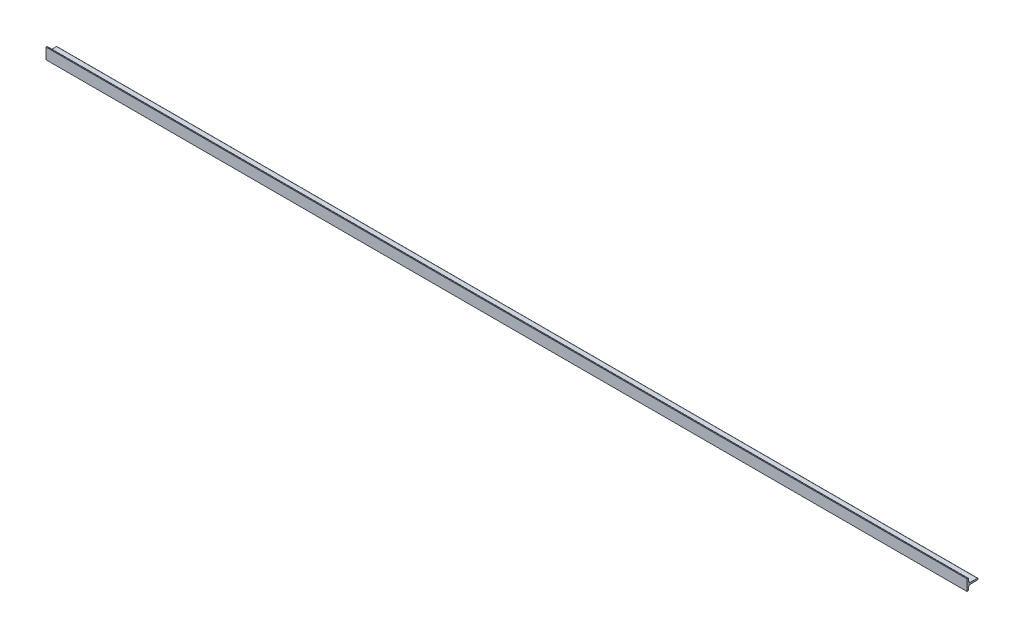
ISO-10303-21;
HEADER;
FILE_DESCRIPTION(('STEP AP214'),'2;1');
FILE_NAME('part.step','',(''),(''),'','','');
FILE_SCHEMA(('AUTOMOTIVE_DESIGN { 1 0 10303 214 1 1 1 1 }'));
ENDSEC;
DATA;
#1=APPLICATION_CONTEXT('core data for automotive mechanical design processes');
#2=APPLICATION_PROTOCOL_DEFINITION('international standard','automotive_design',2000,#1);
#3=PRODUCT_CONTEXT('',#1,'mechanical');
#4=PRODUCT('Part','Part','',(#3));
#5=PRODUCT_RELATED_PRODUCT_CATEGORY('part','',(#4));
#6=PRODUCT_DEFINITION_FORMATION('','',#4);
#7=PRODUCT_DEFINITION_CONTEXT('part definition',#1,'design');
#8=PRODUCT_DEFINITION('design','',#6,#7);
#9=PRODUCT_DEFINITION_SHAPE('','',#8);
#10=(LENGTH_UNIT() NAMED_UNIT(*) SI_UNIT(.MILLI.,.METRE.));
#11=(NAMED_UNIT(*) PLANE_ANGLE_UNIT() SI_UNIT($,.RADIAN.));
#12=(NAMED_UNIT(*) SI_UNIT($,.STERADIAN.) SOLID_ANGLE_UNIT());
#13=UNCERTAINTY_MEASURE_WITH_UNIT(LENGTH_MEASURE(1.E-05),#10,'distance_accuracy_value','');
#14=(GEOMETRIC_REPRESENTATION_CONTEXT(3) GLOBAL_UNCERTAINTY_ASSIGNED_CONTEXT((#13)) GLOBAL_UNIT_ASSIGNED_CONTEXT((#10,
#11,#12)) REPRESENTATION_CONTEXT('',''));
#15=CARTESIAN_POINT('',(0.,0.,0.));
#16=DIRECTION('',(0.,0.,1.));
#17=DIRECTION('',(1.,0.,0.));
#18=AXIS2_PLACEMENT_3D('',#15,#16,#17);
#19=CARTESIAN_POINT('',(1674.,-9.99999999999999,20.));
#20=DIRECTION('',(0.,1.,0.));
#21=DIRECTION('',(0.,0.,1.));
#22=AXIS2_PLACEMENT_3D('',#19,#20,#21);
#23=PLANE('',#22);
#24=DIRECTION('',(0.,0.,-1.));
#25=VECTOR('',#24,1.);
#26=CARTESIAN_POINT('',(0.,-9.99999999999999,20.));
#27=LINE('',#26,#25);
#28=CARTESIAN_POINT('',(0.,-9.99999999999999,20.));
#29=VERTEX_POINT('',#28);
#30=CARTESIAN_POINT('',(0.,-9.99999999999999,18.570314587422));
#31=VERTEX_POINT('',#30);
#32=EDGE_CURVE('E216',#29,#31,#27,.T.);
#33=ORIENTED_EDGE('',*,*,#32,.T.);
#34=DIRECTION('',(-1.,0.,0.));
#35=VECTOR('',#34,1.);
#36=CARTESIAN_POINT('',(1674.,-9.99999999999999,18.570314587422));
#37=LINE('',#36,#35);
#38=CARTESIAN_POINT('',(1674.,-9.99999999999999,18.570314587422));
#39=VERTEX_POINT('',#38);
#40=EDGE_CURVE('E13',#39,#31,#37,.T.);
#41=ORIENTED_EDGE('',*,*,#40,.F.);
#42=DIRECTION('',(0.,0.,-1.));
#43=VECTOR('',#42,1.);
#44=CARTESIAN_POINT('',(1674.,-9.99999999999999,20.));
#45=LINE('',#44,#43);
#46=CARTESIAN_POINT('',(1674.,-9.99999999999999,20.));
#47=VERTEX_POINT('',#46);
#48=EDGE_CURVE('E242',#47,#39,#45,.T.);
#49=ORIENTED_EDGE('',*,*,#48,.F.);
#50=DIRECTION('',(-1.,0.,0.));
#51=VECTOR('',#50,1.);
#52=CARTESIAN_POINT('',(1674.,-9.99999999999999,20.));
#53=LINE('',#52,#51);
#54=EDGE_CURVE('E212',#47,#29,#53,.T.);
#55=ORIENTED_EDGE('',*,*,#54,.T.);
#56=EDGE_LOOP('',(#33,#41,#49,#55));
#57=FACE_BOUND('',#56,.T.);
#58=ADVANCED_FACE('F84',(#57),#23,.F.);
#59=CARTESIAN_POINT('',(1674.,-8.49999999999999,18.570314587422));
#60=DIRECTION('',(-1.,0.,0.));
#61=DIRECTION('',(0.,0.,1.));
#62=AXIS2_PLACEMENT_3D('',#59,#60,#61);
#63=CYLINDRICAL_SURFACE('',#62,1.5);
#64=CARTESIAN_POINT('',(0.,-8.49999999999999,18.570314587422));
#65=DIRECTION('',(1.,0.,0.));
#66=DIRECTION('',(0.,0.,1.));
#67=AXIS2_PLACEMENT_3D('',#64,#65,#66);
#68=CIRCLE('',#67,1.5);
#69=CARTESIAN_POINT('',(0.,-8.53000020943977,17.0706146216177));
#70=VERTEX_POINT('',#69);
#71=EDGE_CURVE('E219',#31,#70,#68,.T.);
#72=ORIENTED_EDGE('',*,*,#71,.T.);
#73=DIRECTION('',(-1.,0.,0.));
#74=VECTOR('',#73,1.);
#75=CARTESIAN_POINT('',(1674.,-8.53000020943977,17.0706146216177));
#76=LINE('',#75,#74);
#77=CARTESIAN_POINT('',(1674.,-8.53000020943977,17.0706146216177));
#78=VERTEX_POINT('',#77);
#79=EDGE_CURVE('E92',#78,#70,#76,.T.);
#80=ORIENTED_EDGE('',*,*,#79,.F.);
#81=CARTESIAN_POINT('',(1674.,-8.49999999999999,18.570314587422));
#82=DIRECTION('',(1.,0.,0.));
#83=DIRECTION('',(0.,0.,1.));
#84=AXIS2_PLACEMENT_3D('',#81,#82,#83);
#85=CIRCLE('',#84,1.5);
#86=EDGE_CURVE('E161',#39,#78,#85,.T.);
#87=ORIENTED_EDGE('',*,*,#86,.F.);
#88=ORIENTED_EDGE('',*,*,#40,.T.);
#89=EDGE_LOOP('',(#72,#80,#87,#88));
#90=FACE_BOUND('',#89,.T.);
#91=ADVANCED_FACE('F330',(#90),#63,.T.);
#92=CARTESIAN_POINT('',(1674.,-4.52043643216432,16.9904067428265));
#93=DIRECTION('',(0.,0.020000139626522,0.9997999772029));
#94=DIRECTION('',(0.,-0.9997999772029,0.020000139626522));
#95=AXIS2_PLACEMENT_3D('',#92,#93,#94);
#96=PLANE('',#95);
#97=DIRECTION('',(0.,0.9997999772029,-0.020000139626522));
#98=VECTOR('',#97,1.);
#99=CARTESIAN_POINT('',(0.,-4.52043643216432,16.9904067428265));
#100=LINE('',#99,#98);
#101=CARTESIAN_POINT('',(0.,-4.52043643216432,16.9904067428265));
#102=VERTEX_POINT('',#101);
#103=EDGE_CURVE('E221',#70,#102,#100,.T.);
#104=ORIENTED_EDGE('',*,*,#103,.T.);
#105=DIRECTION('',(-1.,0.,0.));
#106=VECTOR('',#105,1.);
#107=CARTESIAN_POINT('',(1674.,-4.52043643216432,16.9904067428265));
#108=LINE('',#107,#106);
#109=CARTESIAN_POINT('',(1674.,-4.52043643216432,16.9904067428265));
#110=VERTEX_POINT('',#109);
#111=EDGE_CURVE('E267',#110,#102,#108,.T.);
#112=ORIENTED_EDGE('',*,*,#111,.F.);
#113=DIRECTION('',(0.,0.9997999772029,-0.020000139626522));
#114=VECTOR('',#113,1.);
#115=CARTESIAN_POINT('',(1674.,-4.52043643216432,16.9904067428265));
#116=LINE('',#115,#114);
#117=EDGE_CURVE('E275',#78,#110,#116,.T.);
#118=ORIENTED_EDGE('',*,*,#117,.F.);
#119=ORIENTED_EDGE('',*,*,#79,.T.);
#120=EDGE_LOOP('',(#104,#112,#118,#119));
#121=FACE_BOUND('',#120,.T.);
#122=ADVANCED_FACE('F273',(#121),#96,.F.);
#123=CARTESIAN_POINT('',(1674.,-4.58043685104389,13.9910068112178));
#124=DIRECTION('',(-1.,0.,0.));
#125=DIRECTION('',(0.,0.,1.));
#126=AXIS2_PLACEMENT_3D('',#123,#124,#125);
#127=CYLINDRICAL_SURFACE('',#126,3.);
#128=CARTESIAN_POINT('',(0.,-4.58043685104389,13.9910068112178));
#129=DIRECTION('',(-1.,0.,0.));
#130=DIRECTION('',(0.,0.,-1.));
#131=AXIS2_PLACEMENT_3D('',#128,#129,#130);
#132=CIRCLE('',#131,3.);
#133=CARTESIAN_POINT('',(0.,-1.58103691943519,14.0510072300973));
#134=VERTEX_POINT('',#133);
#135=EDGE_CURVE('E223',#102,#134,#132,.T.);
#136=ORIENTED_EDGE('',*,*,#135,.T.);
#137=DIRECTION('',(-1.,0.,0.));
#138=VECTOR('',#137,1.);
#139=CARTESIAN_POINT('',(1674.,-1.58103691943519,14.0510072300973));
#140=LINE('',#139,#138);
#141=CARTESIAN_POINT('',(1674.,-1.58103691943519,14.0510072300973));
#142=VERTEX_POINT('',#141);
#143=EDGE_CURVE('E264',#142,#134,#140,.T.);
#144=ORIENTED_EDGE('',*,*,#143,.F.);
#145=CARTESIAN_POINT('',(1674.,-4.58043685104389,13.9910068112178));
#146=DIRECTION('',(-1.,0.,0.));
#147=DIRECTION('',(0.,0.,-1.));
#148=AXIS2_PLACEMENT_3D('',#145,#146,#147);
#149=CIRCLE('',#148,3.);
#150=EDGE_CURVE('E293',#110,#142,#149,.T.);
#151=ORIENTED_EDGE('',*,*,#150,.F.);
#152=ORIENTED_EDGE('',*,*,#111,.T.);
#153=EDGE_LOOP('',(#136,#144,#151,#152));
#154=FACE_BOUND('',#153,.T.);
#155=ADVANCED_FACE('F284',(#154),#127,.F.);
#156=CARTESIAN_POINT('',(1674.,-1.3195626461658,0.97999986037347));
#157=DIRECTION('',(0.,0.9997999772029,0.0200001396265305));
#158=DIRECTION('',(0.,-0.0200001396265305,0.9997999772029));
#159=AXIS2_PLACEMENT_3D('',#156,#157,#158);
#160=PLANE('',#159);
#161=DIRECTION('',(0.,0.0200001396265305,-0.9997999772029));
#162=VECTOR('',#161,1.);
#163=CARTESIAN_POINT('',(0.,-1.3195626461658,0.97999986037347));
#164=LINE('',#163,#162);
#165=CARTESIAN_POINT('',(0.,-1.3195626461658,0.979999860373471));
#166=VERTEX_POINT('',#165);
#167=EDGE_CURVE('E225',#134,#166,#164,.T.);
#168=ORIENTED_EDGE('',*,*,#167,.T.);
#169=DIRECTION('',(-1.,0.,0.));
#170=VECTOR('',#169,1.);
#171=CARTESIAN_POINT('',(1674.,-1.3195626461658,0.979999860373471));
#172=LINE('',#171,#170);
#173=CARTESIAN_POINT('',(1674.,-1.3195626461658,0.979999860373471));
#174=VERTEX_POINT('',#173);
#175=EDGE_CURVE('E261',#174,#166,#172,.T.);
#176=ORIENTED_EDGE('',*,*,#175,.F.);
#177=DIRECTION('',(0.,0.0200001396265305,-0.9997999772029));
#178=VECTOR('',#177,1.);
#179=CARTESIAN_POINT('',(1674.,-1.3195626461658,0.97999986037347));
#180=LINE('',#179,#178);
#181=EDGE_CURVE('E290',#142,#174,#180,.T.);
#182=ORIENTED_EDGE('',*,*,#181,.F.);
#183=ORIENTED_EDGE('',*,*,#143,.T.);
#184=EDGE_LOOP('',(#168,#176,#182,#183));
#185=FACE_BOUND('',#184,.T.);
#186=ADVANCED_FACE('F288',(#185),#160,.F.);
#187=CARTESIAN_POINT('',(1674.,-0.319762668962899,1.));
#188=DIRECTION('',(-1.,0.,0.));
#189=DIRECTION('',(0.,0.,1.));
#190=AXIS2_PLACEMENT_3D('',#187,#188,#189);
#191=CYLINDRICAL_SURFACE('',#190,1.);
#192=CARTESIAN_POINT('',(0.,-0.319762668962899,1.));
#193=DIRECTION('',(1.,0.,0.));
#194=DIRECTION('',(0.,0.,1.));
#195=AXIS2_PLACEMENT_3D('',#192,#193,#194);
#196=CIRCLE('',#195,1.);
#197=CARTESIAN_POINT('',(0.,-0.319762668962899,0.));
#198=VERTEX_POINT('',#197);
#199=EDGE_CURVE('E227',#166,#198,#196,.T.);
#200=ORIENTED_EDGE('',*,*,#199,.T.);
#201=DIRECTION('',(-1.,0.,0.));
#202=VECTOR('',#201,1.);
#203=CARTESIAN_POINT('',(1674.,-0.319762668962899,0.));
#204=LINE('',#203,#202);
#205=CARTESIAN_POINT('',(1674.,-0.319762668962899,0.));
#206=VERTEX_POINT('',#205);
#207=EDGE_CURVE('E258',#206,#198,#204,.T.);
#208=ORIENTED_EDGE('',*,*,#207,.F.);
#209=CARTESIAN_POINT('',(1674.,-0.319762668962899,1.));
#210=DIRECTION('',(1.,0.,0.));
#211=DIRECTION('',(0.,0.,1.));
#212=AXIS2_PLACEMENT_3D('',#209,#210,#211);
#213=CIRCLE('',#212,1.);
#214=EDGE_CURVE('E292',#174,#206,#213,.T.);
#215=ORIENTED_EDGE('',*,*,#214,.F.);
#216=ORIENTED_EDGE('',*,*,#175,.T.);
#217=EDGE_LOOP('',(#200,#208,#215,#216));
#218=FACE_BOUND('',#217,.T.);
#219=ADVANCED_FACE('F343',(#218),#191,.T.);
#220=CARTESIAN_POINT('',(1674.,-0.319762668962899,0.));
#221=DIRECTION('',(0.,0.,1.));
#222=DIRECTION('',(0.,-1.,0.));
#223=AXIS2_PLACEMENT_3D('',#220,#221,#222);
#224=PLANE('',#223);
#225=DIRECTION('',(0.,1.,0.));
#226=VECTOR('',#225,1.);
#227=CARTESIAN_POINT('',(0.,-0.319762668962899,0.));
#228=LINE('',#227,#226);
#229=CARTESIAN_POINT('',(0.,0.319762668962919,0.));
#230=VERTEX_POINT('',#229);
#231=EDGE_CURVE('E229',#198,#230,#228,.T.);
#232=ORIENTED_EDGE('',*,*,#231,.T.);
#233=DIRECTION('',(-1.,0.,0.));
#234=VECTOR('',#233,1.);
#235=CARTESIAN_POINT('',(1674.,0.319762668962919,0.));
#236=LINE('',#235,#234);
#237=CARTESIAN_POINT('',(1674.,0.319762668962919,0.));
#238=VERTEX_POINT('',#237);
#239=EDGE_CURVE('E255',#238,#230,#236,.T.);
#240=ORIENTED_EDGE('',*,*,#239,.F.);
#241=DIRECTION('',(0.,1.,0.));
#242=VECTOR('',#241,1.);
#243=CARTESIAN_POINT('',(1674.,-0.319762668962899,0.));
#244=LINE('',#243,#242);
#245=EDGE_CURVE('E295',#206,#238,#244,.T.);
#246=ORIENTED_EDGE('',*,*,#245,.F.);
#247=ORIENTED_EDGE('',*,*,#207,.T.);
#248=EDGE_LOOP('',(#232,#240,#246,#247));
#249=FACE_BOUND('',#248,.T.);
#250=ADVANCED_FACE('F346',(#249),#224,.F.);
#251=CARTESIAN_POINT('',(1674.,0.319762668962918,1.));
#252=DIRECTION('',(-1.,0.,0.));
#253=DIRECTION('',(0.,0.,1.));
#254=AXIS2_PLACEMENT_3D('',#251,#252,#253);
#255=CYLINDRICAL_SURFACE('',#254,1.);
#256=CARTESIAN_POINT('',(0.,0.319762668962918,1.));
#257=DIRECTION('',(1.,0.,0.));
#258=DIRECTION('',(0.,0.,1.));
#259=AXIS2_PLACEMENT_3D('',#256,#257,#258);
#260=CIRCLE('',#259,1.);
#261=CARTESIAN_POINT('',(0.,1.31956264616582,0.97999986037347));
#262=VERTEX_POINT('',#261);
#263=EDGE_CURVE('E231',#230,#262,#260,.T.);
#264=ORIENTED_EDGE('',*,*,#263,.T.);
#265=DIRECTION('',(-1.,0.,0.));
#266=VECTOR('',#265,1.);
#267=CARTESIAN_POINT('',(1674.,1.31956264616582,0.97999986037347));
#268=LINE('',#267,#266);
#269=CARTESIAN_POINT('',(1674.,1.31956264616582,0.97999986037347));
#270=VERTEX_POINT('',#269);
#271=EDGE_CURVE('E252',#270,#262,#268,.T.);
#272=ORIENTED_EDGE('',*,*,#271,.F.);
#273=CARTESIAN_POINT('',(1674.,0.319762668962918,1.));
#274=DIRECTION('',(1.,0.,0.));
#275=DIRECTION('',(0.,0.,1.));
#276=AXIS2_PLACEMENT_3D('',#273,#274,#275);
#277=CIRCLE('',#276,1.);
#278=EDGE_CURVE('E301',#238,#270,#277,.T.);
#279=ORIENTED_EDGE('',*,*,#278,.F.);
#280=ORIENTED_EDGE('',*,*,#239,.T.);
#281=EDGE_LOOP('',(#264,#272,#279,#280));
#282=FACE_BOUND('',#281,.T.);
#283=ADVANCED_FACE('F350',(#282),#255,.T.);
#284=CARTESIAN_POINT('',(1674.,1.58103691943522,14.0510072300973));
#285=DIRECTION('',(0.,-0.9997999772029,0.0200001396265308));
#286=DIRECTION('',(0.,-0.0200001396265308,-0.9997999772029));
#287=AXIS2_PLACEMENT_3D('',#284,#285,#286);
#288=PLANE('',#287);
#289=DIRECTION('',(0.,0.0200001396265308,0.9997999772029));
#290=VECTOR('',#289,1.);
#291=CARTESIAN_POINT('',(0.,1.58103691943522,14.0510072300973));
#292=LINE('',#291,#290);
#293=CARTESIAN_POINT('',(0.,1.58103691943521,14.0510072300973));
#294=VERTEX_POINT('',#293);
#295=EDGE_CURVE('E233',#262,#294,#292,.T.);
#296=ORIENTED_EDGE('',*,*,#295,.T.);
#297=DIRECTION('',(-1.,0.,0.));
#298=VECTOR('',#297,1.);
#299=CARTESIAN_POINT('',(1674.,1.58103691943521,14.0510072300973));
#300=LINE('',#299,#298);
#301=CARTESIAN_POINT('',(1674.,1.58103691943521,14.0510072300973));
#302=VERTEX_POINT('',#301);
#303=EDGE_CURVE('E249',#302,#294,#300,.T.);
#304=ORIENTED_EDGE('',*,*,#303,.F.);
#305=DIRECTION('',(0.,0.0200001396265308,0.9997999772029));
#306=VECTOR('',#305,1.);
#307=CARTESIAN_POINT('',(1674.,1.58103691943522,14.0510072300973));
#308=LINE('',#307,#306);
#309=EDGE_CURVE('E303',#270,#302,#308,.T.);
#310=ORIENTED_EDGE('',*,*,#309,.F.);
#311=ORIENTED_EDGE('',*,*,#271,.T.);
#312=EDGE_LOOP('',(#296,#304,#310,#311));
#313=FACE_BOUND('',#312,.T.);
#314=ADVANCED_FACE('F354',(#313),#288,.F.);
#315=CARTESIAN_POINT('',(1674.,4.58043685104392,13.9910068112178));
#316=DIRECTION('',(-1.,0.,0.));
#317=DIRECTION('',(0.,0.,1.));
#318=AXIS2_PLACEMENT_3D('',#315,#316,#317);
#319=CYLINDRICAL_SURFACE('',#318,3.);
#320=CARTESIAN_POINT('',(0.,4.58043685104392,13.9910068112178));
#321=DIRECTION('',(-1.,0.,0.));
#322=DIRECTION('',(0.,0.,-1.));
#323=AXIS2_PLACEMENT_3D('',#320,#321,#322);
#324=CIRCLE('',#323,3.);
#325=CARTESIAN_POINT('',(0.,4.52043643216434,16.9904067428265));
#326=VERTEX_POINT('',#325);
#327=EDGE_CURVE('E235',#294,#326,#324,.T.);
#328=ORIENTED_EDGE('',*,*,#327,.T.);
#329=DIRECTION('',(-1.,0.,0.));
#330=VECTOR('',#329,1.);
#331=CARTESIAN_POINT('',(1674.,4.52043643216434,16.9904067428265));
#332=LINE('',#331,#330);
#333=CARTESIAN_POINT('',(1674.,4.52043643216434,16.9904067428265));
#334=VERTEX_POINT('',#333);
#335=EDGE_CURVE('E246',#334,#326,#332,.T.);
#336=ORIENTED_EDGE('',*,*,#335,.F.);
#337=CARTESIAN_POINT('',(1674.,4.58043685104392,13.9910068112178));
#338=DIRECTION('',(-1.,0.,0.));
#339=DIRECTION('',(0.,0.,-1.));
#340=AXIS2_PLACEMENT_3D('',#337,#338,#339);
#341=CIRCLE('',#340,3.);
#342=EDGE_CURVE('E305',#302,#334,#341,.T.);
#343=ORIENTED_EDGE('',*,*,#342,.F.);
#344=ORIENTED_EDGE('',*,*,#303,.T.);
#345=EDGE_LOOP('',(#328,#336,#343,#344));
#346=FACE_BOUND('',#345,.T.);
#347=ADVANCED_FACE('F311',(#346),#319,.F.);
#348=CARTESIAN_POINT('',(1674.,8.53000020943979,17.0706146216177));
#349=DIRECTION('',(0.,-0.020000139626522,0.9997999772029));
#350=DIRECTION('',(0.,-0.9997999772029,-0.020000139626522));
#351=AXIS2_PLACEMENT_3D('',#348,#349,#350);
#352=PLANE('',#351);
#353=DIRECTION('',(0.,0.9997999772029,0.020000139626522));
#354=VECTOR('',#353,1.);
#355=CARTESIAN_POINT('',(0.,8.53000020943979,17.0706146216177));
#356=LINE('',#355,#354);
#357=CARTESIAN_POINT('',(0.,8.53000020943979,17.0706146216177));
#358=VERTEX_POINT('',#357);
#359=EDGE_CURVE('E237',#326,#358,#356,.T.);
#360=ORIENTED_EDGE('',*,*,#359,.T.);
#361=DIRECTION('',(-1.,0.,0.));
#362=VECTOR('',#361,1.);
#363=CARTESIAN_POINT('',(1674.,8.53000020943979,17.0706146216177));
#364=LINE('',#363,#362);
#365=CARTESIAN_POINT('',(1674.,8.53000020943979,17.0706146216177));
#366=VERTEX_POINT('',#365);
#367=EDGE_CURVE('E207',#366,#358,#364,.T.);
#368=ORIENTED_EDGE('',*,*,#367,.F.);
#369=DIRECTION('',(0.,0.9997999772029,0.020000139626522));
#370=VECTOR('',#369,1.);
#371=CARTESIAN_POINT('',(1674.,8.53000020943979,17.0706146216177));
#372=LINE('',#371,#370);
#373=EDGE_CURVE('E198',#334,#366,#372,.T.);
#374=ORIENTED_EDGE('',*,*,#373,.F.);
#375=ORIENTED_EDGE('',*,*,#335,.T.);
#376=EDGE_LOOP('',(#360,#368,#374,#375));
#377=FACE_BOUND('',#376,.T.);
#378=ADVANCED_FACE('F315',(#377),#352,.F.);
#379=CARTESIAN_POINT('',(1674.,8.50000000000001,18.570314587422));
#380=DIRECTION('',(-1.,0.,0.));
#381=DIRECTION('',(0.,0.,1.));
#382=AXIS2_PLACEMENT_3D('',#379,#380,#381);
#383=CYLINDRICAL_SURFACE('',#382,1.5);
#384=CARTESIAN_POINT('',(0.,8.50000000000001,18.570314587422));
#385=DIRECTION('',(1.,0.,0.));
#386=DIRECTION('',(0.,0.,-1.));
#387=AXIS2_PLACEMENT_3D('',#384,#385,#386);
#388=CIRCLE('',#387,1.5);
#389=CARTESIAN_POINT('',(0.,10.,18.570314587422));
#390=VERTEX_POINT('',#389);
#391=EDGE_CURVE('E206',#358,#390,#388,.T.);
#392=ORIENTED_EDGE('',*,*,#391,.T.);
#393=DIRECTION('',(-1.,0.,0.));
#394=VECTOR('',#393,1.);
#395=CARTESIAN_POINT('',(1674.,10.,18.570314587422));
#396=LINE('',#395,#394);
#397=CARTESIAN_POINT('',(1674.,10.,18.570314587422));
#398=VERTEX_POINT('',#397);
#399=EDGE_CURVE('E203',#398,#390,#396,.T.);
#400=ORIENTED_EDGE('',*,*,#399,.F.);
#401=CARTESIAN_POINT('',(1674.,8.50000000000001,18.570314587422));
#402=DIRECTION('',(1.,0.,0.));
#403=DIRECTION('',(0.,0.,-1.));
#404=AXIS2_PLACEMENT_3D('',#401,#402,#403);
#405=CIRCLE('',#404,1.5);
#406=EDGE_CURVE('E192',#366,#398,#405,.T.);
#407=ORIENTED_EDGE('',*,*,#406,.F.);
#408=ORIENTED_EDGE('',*,*,#367,.T.);
#409=EDGE_LOOP('',(#392,#400,#407,#408));
#410=FACE_BOUND('',#409,.T.);
#411=ADVANCED_FACE('F204',(#410),#383,.T.);
#412=CARTESIAN_POINT('',(1674.,10.,20.));
#413=DIRECTION('',(0.,-1.,0.));
#414=DIRECTION('',(0.,0.,-1.));
#415=AXIS2_PLACEMENT_3D('',#412,#413,#414);
#416=PLANE('',#415);
#417=DIRECTION('',(0.,0.,1.));
#418=VECTOR('',#417,1.);
#419=CARTESIAN_POINT('',(0.,10.,20.));
#420=LINE('',#419,#418);
#421=CARTESIAN_POINT('',(0.,10.,20.));
#422=VERTEX_POINT('',#421);
#423=EDGE_CURVE('E147',#390,#422,#420,.T.);
#424=ORIENTED_EDGE('',*,*,#423,.T.);
#425=DIRECTION('',(-1.,0.,0.));
#426=VECTOR('',#425,1.);
#427=CARTESIAN_POINT('',(1674.,10.,20.));
#428=LINE('',#427,#426);
#429=CARTESIAN_POINT('',(1674.,10.,20.));
#430=VERTEX_POINT('',#429);
#431=EDGE_CURVE('E208',#430,#422,#428,.T.);
#432=ORIENTED_EDGE('',*,*,#431,.F.);
#433=DIRECTION('',(0.,0.,1.));
#434=VECTOR('',#433,1.);
#435=CARTESIAN_POINT('',(1674.,10.,20.));
#436=LINE('',#435,#434);
#437=EDGE_CURVE('E196',#398,#430,#436,.T.);
#438=ORIENTED_EDGE('',*,*,#437,.F.);
#439=ORIENTED_EDGE('',*,*,#399,.T.);
#440=EDGE_LOOP('',(#424,#432,#438,#439));
#441=FACE_BOUND('',#440,.T.);
#442=ADVANCED_FACE('F210',(#441),#416,.F.);
#443=CARTESIAN_POINT('',(1674.,-9.99999999999999,20.));
#444=DIRECTION('',(0.,0.,-1.));
#445=DIRECTION('',(-1.,0.,0.));
#446=AXIS2_PLACEMENT_3D('',#443,#444,#445);
#447=PLANE('',#446);
#448=DIRECTION('',(0.,-1.,0.));
#449=VECTOR('',#448,1.);
#450=CARTESIAN_POINT('',(0.,-9.99999999999999,20.));
#451=LINE('',#450,#449);
#452=EDGE_CURVE('E153',#422,#29,#451,.T.);
#453=ORIENTED_EDGE('',*,*,#452,.T.);
#454=ORIENTED_EDGE('',*,*,#54,.F.);
#455=DIRECTION('',(0.,-1.,0.));
#456=VECTOR('',#455,1.);
#457=CARTESIAN_POINT('',(1674.,-9.99999999999999,20.));
#458=LINE('',#457,#456);
#459=EDGE_CURVE('E100',#430,#47,#458,.T.);
#460=ORIENTED_EDGE('',*,*,#459,.F.);
#461=ORIENTED_EDGE('',*,*,#431,.T.);
#462=EDGE_LOOP('',(#453,#454,#460,#461));
#463=FACE_BOUND('',#462,.T.);
#464=ADVANCED_FACE('F319',(#463),#447,.F.);
#465=CARTESIAN_POINT('',(1674.,-8.49999999999999,18.570314587422));
#466=DIRECTION('',(-1.,0.,0.));
#467=DIRECTION('',(0.,0.,1.));
#468=AXIS2_PLACEMENT_3D('',#465,#466,#467);
#469=PLANE('',#468);
#470=ORIENTED_EDGE('',*,*,#48,.T.);
#471=ORIENTED_EDGE('',*,*,#86,.T.);
#472=ORIENTED_EDGE('',*,*,#117,.T.);
#473=ORIENTED_EDGE('',*,*,#150,.T.);
#474=ORIENTED_EDGE('',*,*,#181,.T.);
#475=ORIENTED_EDGE('',*,*,#214,.T.);
#476=ORIENTED_EDGE('',*,*,#245,.T.);
#477=ORIENTED_EDGE('',*,*,#278,.T.);
#478=ORIENTED_EDGE('',*,*,#309,.T.);
#479=ORIENTED_EDGE('',*,*,#342,.T.);
#480=ORIENTED_EDGE('',*,*,#373,.T.);
#481=ORIENTED_EDGE('',*,*,#406,.T.);
#482=ORIENTED_EDGE('',*,*,#437,.T.);
#483=ORIENTED_EDGE('',*,*,#459,.T.);
#484=EDGE_LOOP('',(#470,#471,#472,#473,#474,#475,#476,#477,#478,#479,#480,#481,#482,#483));
#485=FACE_BOUND('',#484,.T.);
#486=ADVANCED_FACE('F194',(#485),#469,.F.);
#487=CARTESIAN_POINT('',(0.,-8.49999999999999,18.570314587422));
#488=DIRECTION('',(-1.,0.,0.));
#489=DIRECTION('',(0.,0.,1.));
#490=AXIS2_PLACEMENT_3D('',#487,#488,#489);
#491=PLANE('',#490);
#492=ORIENTED_EDGE('',*,*,#32,.F.);
#493=ORIENTED_EDGE('',*,*,#452,.F.);
#494=ORIENTED_EDGE('',*,*,#423,.F.);
#495=ORIENTED_EDGE('',*,*,#391,.F.);
#496=ORIENTED_EDGE('',*,*,#359,.F.);
#497=ORIENTED_EDGE('',*,*,#327,.F.);
#498=ORIENTED_EDGE('',*,*,#295,.F.);
#499=ORIENTED_EDGE('',*,*,#263,.F.);
#500=ORIENTED_EDGE('',*,*,#231,.F.);
#501=ORIENTED_EDGE('',*,*,#199,.F.);
#502=ORIENTED_EDGE('',*,*,#167,.F.);
#503=ORIENTED_EDGE('',*,*,#135,.F.);
#504=ORIENTED_EDGE('',*,*,#103,.F.);
#505=ORIENTED_EDGE('',*,*,#71,.F.);
#506=EDGE_LOOP('',(#492,#493,#494,#495,#496,#497,#498,#499,#500,#501,#502,#503,#504,#505));
#507=FACE_BOUND('',#506,.T.);
#508=ADVANCED_FACE('F279',(#507),#491,.T.);
#509=CLOSED_SHELL('',(#58,#91,#122,#155,#186,#219,#250,#283,#314,#347,#378,#411,#442,#464,#486,#508));
#510=MANIFOLD_SOLID_BREP('B2',#509);
#511=ADVANCED_BREP_SHAPE_REPRESENTATION('',(#18,#510),#14);
#512=SHAPE_DEFINITION_REPRESENTATION(#9,#511);
ENDSEC;
END-ISO-10303-21;
